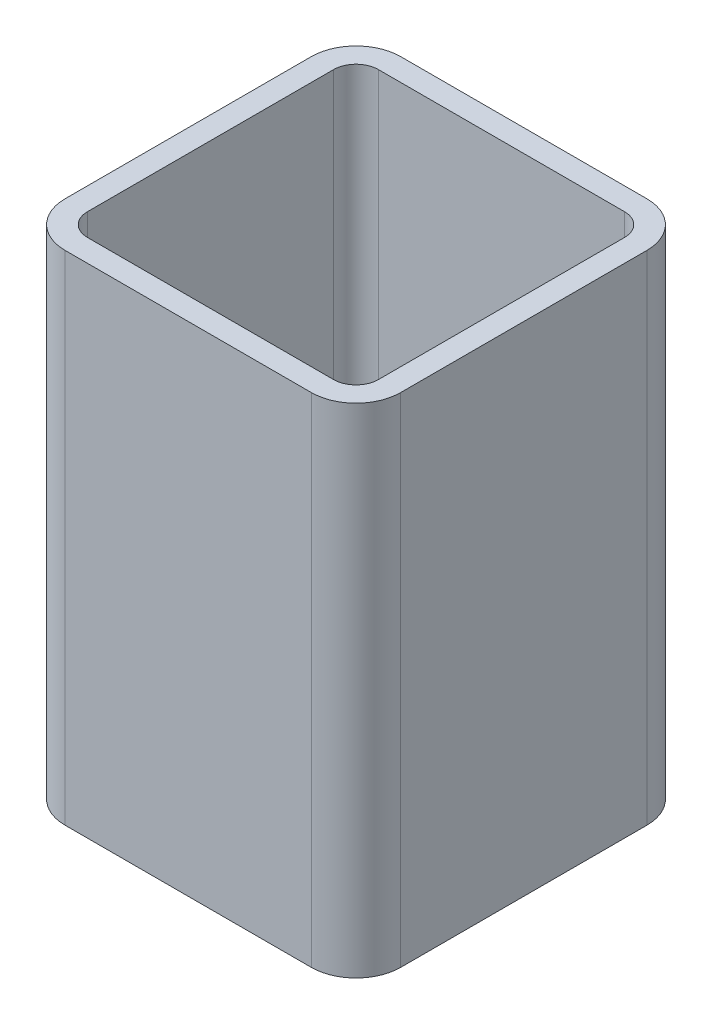
ISO-10303-21;
HEADER;
FILE_DESCRIPTION(('STEP AP214'),'2;1');
FILE_NAME('part.step','',(''),(''),'','','');
FILE_SCHEMA(('AUTOMOTIVE_DESIGN { 1 0 10303 214 1 1 1 1 }'));
ENDSEC;
DATA;
#1=APPLICATION_CONTEXT('core data for automotive mechanical design processes');
#2=APPLICATION_PROTOCOL_DEFINITION('international standard','automotive_design',2000,#1);
#3=PRODUCT_CONTEXT('',#1,'mechanical');
#4=PRODUCT('Part','Part','',(#3));
#5=PRODUCT_RELATED_PRODUCT_CATEGORY('part','',(#4));
#6=PRODUCT_DEFINITION_FORMATION('','',#4);
#7=PRODUCT_DEFINITION_CONTEXT('part definition',#1,'design');
#8=PRODUCT_DEFINITION('design','',#6,#7);
#9=PRODUCT_DEFINITION_SHAPE('','',#8);
#10=(LENGTH_UNIT() NAMED_UNIT(*) SI_UNIT(.MILLI.,.METRE.));
#11=(NAMED_UNIT(*) PLANE_ANGLE_UNIT() SI_UNIT($,.RADIAN.));
#12=(NAMED_UNIT(*) SI_UNIT($,.STERADIAN.) SOLID_ANGLE_UNIT());
#13=UNCERTAINTY_MEASURE_WITH_UNIT(LENGTH_MEASURE(1.E-05),#10,'distance_accuracy_value','');
#14=(GEOMETRIC_REPRESENTATION_CONTEXT(3) GLOBAL_UNCERTAINTY_ASSIGNED_CONTEXT((#13)) GLOBAL_UNIT_ASSIGNED_CONTEXT((#10,
#11,#12)) REPRESENTATION_CONTEXT('',''));
#15=CARTESIAN_POINT('',(0.,0.,0.));
#16=DIRECTION('',(0.,0.,1.));
#17=DIRECTION('',(1.,0.,0.));
#18=AXIS2_PLACEMENT_3D('',#15,#16,#17);
#19=CARTESIAN_POINT('',(-11.,44.5,11.));
#20=DIRECTION('',(0.,-1.,0.));
#21=DIRECTION('',(0.,0.,-1.));
#22=AXIS2_PLACEMENT_3D('',#19,#20,#21);
#23=PLANE('',#22);
#24=CARTESIAN_POINT('',(-11.,44.5,11.));
#25=DIRECTION('',(0.,1.,0.));
#26=DIRECTION('',(0.,0.,-1.));
#27=AXIS2_PLACEMENT_3D('',#24,#25,#26);
#28=CIRCLE('',#27,4.);
#29=CARTESIAN_POINT('',(-15.,44.5,11.));
#30=VERTEX_POINT('',#29);
#31=CARTESIAN_POINT('',(-11.,44.5,15.));
#32=VERTEX_POINT('',#31);
#33=EDGE_CURVE('E213',#30,#32,#28,.T.);
#34=ORIENTED_EDGE('',*,*,#33,.T.);
#35=DIRECTION('',(1.,0.,0.));
#36=VECTOR('',#35,1.);
#37=CARTESIAN_POINT('',(-11.,44.5,15.));
#38=LINE('',#37,#36);
#39=CARTESIAN_POINT('',(11.,44.5,15.));
#40=VERTEX_POINT('',#39);
#41=EDGE_CURVE('E216',#32,#40,#38,.T.);
#42=ORIENTED_EDGE('',*,*,#41,.T.);
#43=CARTESIAN_POINT('',(11.,44.5,11.));
#44=DIRECTION('',(0.,1.,0.));
#45=DIRECTION('',(0.,0.,1.));
#46=AXIS2_PLACEMENT_3D('',#43,#44,#45);
#47=CIRCLE('',#46,4.);
#48=CARTESIAN_POINT('',(15.,44.5,11.));
#49=VERTEX_POINT('',#48);
#50=EDGE_CURVE('E219',#40,#49,#47,.T.);
#51=ORIENTED_EDGE('',*,*,#50,.T.);
#52=DIRECTION('',(0.,0.,-1.));
#53=VECTOR('',#52,1.);
#54=CARTESIAN_POINT('',(15.,44.5,11.));
#55=LINE('',#54,#53);
#56=CARTESIAN_POINT('',(15.,44.5,-11.));
#57=VERTEX_POINT('',#56);
#58=EDGE_CURVE('E221',#49,#57,#55,.T.);
#59=ORIENTED_EDGE('',*,*,#58,.T.);
#60=CARTESIAN_POINT('',(11.,44.5,-11.));
#61=DIRECTION('',(0.,1.,0.));
#62=DIRECTION('',(0.,0.,-1.));
#63=AXIS2_PLACEMENT_3D('',#60,#61,#62);
#64=CIRCLE('',#63,4.);
#65=CARTESIAN_POINT('',(11.,44.5,-15.));
#66=VERTEX_POINT('',#65);
#67=EDGE_CURVE('E223',#57,#66,#64,.T.);
#68=ORIENTED_EDGE('',*,*,#67,.T.);
#69=DIRECTION('',(-1.,0.,0.));
#70=VECTOR('',#69,1.);
#71=CARTESIAN_POINT('',(-11.,44.5,-15.));
#72=LINE('',#71,#70);
#73=CARTESIAN_POINT('',(-11.,44.5,-15.));
#74=VERTEX_POINT('',#73);
#75=EDGE_CURVE('E225',#66,#74,#72,.T.);
#76=ORIENTED_EDGE('',*,*,#75,.T.);
#77=CARTESIAN_POINT('',(-11.,44.5,-11.));
#78=DIRECTION('',(0.,1.,0.));
#79=DIRECTION('',(0.,0.,-1.));
#80=AXIS2_PLACEMENT_3D('',#77,#78,#79);
#81=CIRCLE('',#80,4.);
#82=CARTESIAN_POINT('',(-15.,44.5,-11.));
#83=VERTEX_POINT('',#82);
#84=EDGE_CURVE('E227',#74,#83,#81,.T.);
#85=ORIENTED_EDGE('',*,*,#84,.T.);
#86=DIRECTION('',(0.,0.,1.));
#87=VECTOR('',#86,1.);
#88=CARTESIAN_POINT('',(-15.,44.5,11.));
#89=LINE('',#88,#87);
#90=EDGE_CURVE('E229',#83,#30,#89,.T.);
#91=ORIENTED_EDGE('',*,*,#90,.T.);
#92=EDGE_LOOP('',(#34,#42,#51,#59,#68,#76,#85,#91));
#93=FACE_BOUND('',#92,.T.);
#94=CARTESIAN_POINT('',(-11.,44.5,11.));
#95=DIRECTION('',(0.,1.,0.));
#96=DIRECTION('',(0.,0.,-1.));
#97=AXIS2_PLACEMENT_3D('',#94,#95,#96);
#98=CIRCLE('',#97,2.);
#99=CARTESIAN_POINT('',(-13.,44.5,11.));
#100=VERTEX_POINT('',#99);
#101=CARTESIAN_POINT('',(-11.,44.5,13.));
#102=VERTEX_POINT('',#101);
#103=EDGE_CURVE('E148',#100,#102,#98,.T.);
#104=ORIENTED_EDGE('',*,*,#103,.F.);
#105=DIRECTION('',(0.,0.,1.));
#106=VECTOR('',#105,1.);
#107=CARTESIAN_POINT('',(-13.,44.5,11.));
#108=LINE('',#107,#106);
#109=CARTESIAN_POINT('',(-13.,44.5,-11.));
#110=VERTEX_POINT('',#109);
#111=EDGE_CURVE('E181',#110,#100,#108,.T.);
#112=ORIENTED_EDGE('',*,*,#111,.F.);
#113=CARTESIAN_POINT('',(-11.,44.5,-11.));
#114=DIRECTION('',(0.,1.,0.));
#115=DIRECTION('',(0.,0.,-1.));
#116=AXIS2_PLACEMENT_3D('',#113,#114,#115);
#117=CIRCLE('',#116,2.);
#118=CARTESIAN_POINT('',(-11.,44.5,-13.));
#119=VERTEX_POINT('',#118);
#120=EDGE_CURVE('E179',#119,#110,#117,.T.);
#121=ORIENTED_EDGE('',*,*,#120,.F.);
#122=DIRECTION('',(-1.,0.,0.));
#123=VECTOR('',#122,1.);
#124=CARTESIAN_POINT('',(-11.,44.5,-13.));
#125=LINE('',#124,#123);
#126=CARTESIAN_POINT('',(11.,44.5,-13.));
#127=VERTEX_POINT('',#126);
#128=EDGE_CURVE('E177',#127,#119,#125,.T.);
#129=ORIENTED_EDGE('',*,*,#128,.F.);
#130=CARTESIAN_POINT('',(11.,44.5,-11.));
#131=DIRECTION('',(0.,1.,0.));
#132=DIRECTION('',(0.,0.,-1.));
#133=AXIS2_PLACEMENT_3D('',#130,#131,#132);
#134=CIRCLE('',#133,2.);
#135=CARTESIAN_POINT('',(13.,44.5,-11.));
#136=VERTEX_POINT('',#135);
#137=EDGE_CURVE('E175',#136,#127,#134,.T.);
#138=ORIENTED_EDGE('',*,*,#137,.F.);
#139=DIRECTION('',(0.,0.,-1.));
#140=VECTOR('',#139,1.);
#141=CARTESIAN_POINT('',(13.,44.5,11.));
#142=LINE('',#141,#140);
#143=CARTESIAN_POINT('',(13.,44.5,11.));
#144=VERTEX_POINT('',#143);
#145=EDGE_CURVE('E171',#144,#136,#142,.T.);
#146=ORIENTED_EDGE('',*,*,#145,.F.);
#147=CARTESIAN_POINT('',(11.,44.5,11.));
#148=DIRECTION('',(0.,1.,0.));
#149=DIRECTION('',(0.,0.,1.));
#150=AXIS2_PLACEMENT_3D('',#147,#148,#149);
#151=CIRCLE('',#150,2.);
#152=CARTESIAN_POINT('',(11.,44.5,13.));
#153=VERTEX_POINT('',#152);
#154=EDGE_CURVE('E169',#153,#144,#151,.T.);
#155=ORIENTED_EDGE('',*,*,#154,.F.);
#156=DIRECTION('',(1.,0.,0.));
#157=VECTOR('',#156,1.);
#158=CARTESIAN_POINT('',(-11.,44.5,13.));
#159=LINE('',#158,#157);
#160=EDGE_CURVE('E156',#102,#153,#159,.T.);
#161=ORIENTED_EDGE('',*,*,#160,.F.);
#162=EDGE_LOOP('',(#104,#112,#121,#129,#138,#146,#155,#161));
#163=FACE_BOUND('',#162,.T.);
#164=ADVANCED_FACE('F35',(#93,#163),#23,.F.);
#165=CARTESIAN_POINT('',(-11.,0.,11.));
#166=DIRECTION('',(0.,-1.,0.));
#167=DIRECTION('',(0.,0.,-1.));
#168=AXIS2_PLACEMENT_3D('',#165,#166,#167);
#169=PLANE('',#168);
#170=CARTESIAN_POINT('',(-11.,0.,11.));
#171=DIRECTION('',(0.,1.,0.));
#172=DIRECTION('',(0.,0.,-1.));
#173=AXIS2_PLACEMENT_3D('',#170,#171,#172);
#174=CIRCLE('',#173,4.);
#175=CARTESIAN_POINT('',(-15.,0.,11.));
#176=VERTEX_POINT('',#175);
#177=CARTESIAN_POINT('',(-11.,0.,15.));
#178=VERTEX_POINT('',#177);
#179=EDGE_CURVE('E164',#176,#178,#174,.T.);
#180=ORIENTED_EDGE('',*,*,#179,.F.);
#181=DIRECTION('',(0.,0.,1.));
#182=VECTOR('',#181,1.);
#183=CARTESIAN_POINT('',(-15.,0.,11.));
#184=LINE('',#183,#182);
#185=CARTESIAN_POINT('',(-15.,0.,-11.));
#186=VERTEX_POINT('',#185);
#187=EDGE_CURVE('E217',#186,#176,#184,.T.);
#188=ORIENTED_EDGE('',*,*,#187,.F.);
#189=CARTESIAN_POINT('',(-11.,0.,-11.));
#190=DIRECTION('',(0.,1.,0.));
#191=DIRECTION('',(0.,0.,-1.));
#192=AXIS2_PLACEMENT_3D('',#189,#190,#191);
#193=CIRCLE('',#192,4.);
#194=CARTESIAN_POINT('',(-11.,0.,-15.));
#195=VERTEX_POINT('',#194);
#196=EDGE_CURVE('E244',#195,#186,#193,.T.);
#197=ORIENTED_EDGE('',*,*,#196,.F.);
#198=DIRECTION('',(-1.,0.,0.));
#199=VECTOR('',#198,1.);
#200=CARTESIAN_POINT('',(-11.,0.,-15.));
#201=LINE('',#200,#199);
#202=CARTESIAN_POINT('',(11.,0.,-15.));
#203=VERTEX_POINT('',#202);
#204=EDGE_CURVE('E242',#203,#195,#201,.T.);
#205=ORIENTED_EDGE('',*,*,#204,.F.);
#206=CARTESIAN_POINT('',(11.,0.,-11.));
#207=DIRECTION('',(0.,1.,0.));
#208=DIRECTION('',(0.,0.,-1.));
#209=AXIS2_PLACEMENT_3D('',#206,#207,#208);
#210=CIRCLE('',#209,4.);
#211=CARTESIAN_POINT('',(15.,0.,-11.));
#212=VERTEX_POINT('',#211);
#213=EDGE_CURVE('E240',#212,#203,#210,.T.);
#214=ORIENTED_EDGE('',*,*,#213,.F.);
#215=DIRECTION('',(0.,0.,-1.));
#216=VECTOR('',#215,1.);
#217=CARTESIAN_POINT('',(15.,0.,11.));
#218=LINE('',#217,#216);
#219=CARTESIAN_POINT('',(15.,0.,11.));
#220=VERTEX_POINT('',#219);
#221=EDGE_CURVE('E238',#220,#212,#218,.T.);
#222=ORIENTED_EDGE('',*,*,#221,.F.);
#223=CARTESIAN_POINT('',(11.,0.,11.));
#224=DIRECTION('',(0.,1.,0.));
#225=DIRECTION('',(0.,0.,1.));
#226=AXIS2_PLACEMENT_3D('',#223,#224,#225);
#227=CIRCLE('',#226,4.);
#228=CARTESIAN_POINT('',(11.,0.,15.));
#229=VERTEX_POINT('',#228);
#230=EDGE_CURVE('E236',#229,#220,#227,.T.);
#231=ORIENTED_EDGE('',*,*,#230,.F.);
#232=DIRECTION('',(1.,0.,0.));
#233=VECTOR('',#232,1.);
#234=CARTESIAN_POINT('',(-11.,0.,15.));
#235=LINE('',#234,#233);
#236=EDGE_CURVE('E234',#178,#229,#235,.T.);
#237=ORIENTED_EDGE('',*,*,#236,.F.);
#238=EDGE_LOOP('',(#180,#188,#197,#205,#214,#222,#231,#237));
#239=FACE_BOUND('',#238,.T.);
#240=DIRECTION('',(0.,0.,1.));
#241=VECTOR('',#240,1.);
#242=CARTESIAN_POINT('',(-13.,0.,11.));
#243=LINE('',#242,#241);
#244=CARTESIAN_POINT('',(-13.,0.,-11.));
#245=VERTEX_POINT('',#244);
#246=CARTESIAN_POINT('',(-13.,0.,11.));
#247=VERTEX_POINT('',#246);
#248=EDGE_CURVE('E157',#245,#247,#243,.T.);
#249=ORIENTED_EDGE('',*,*,#248,.T.);
#250=CARTESIAN_POINT('',(-11.,0.,11.));
#251=DIRECTION('',(0.,1.,0.));
#252=DIRECTION('',(0.,0.,-1.));
#253=AXIS2_PLACEMENT_3D('',#250,#251,#252);
#254=CIRCLE('',#253,2.);
#255=CARTESIAN_POINT('',(-11.,0.,13.));
#256=VERTEX_POINT('',#255);
#257=EDGE_CURVE('E58',#247,#256,#254,.T.);
#258=ORIENTED_EDGE('',*,*,#257,.T.);
#259=DIRECTION('',(1.,0.,0.));
#260=VECTOR('',#259,1.);
#261=CARTESIAN_POINT('',(-11.,0.,13.));
#262=LINE('',#261,#260);
#263=CARTESIAN_POINT('',(11.,0.,13.));
#264=VERTEX_POINT('',#263);
#265=EDGE_CURVE('E163',#256,#264,#262,.T.);
#266=ORIENTED_EDGE('',*,*,#265,.T.);
#267=CARTESIAN_POINT('',(11.,0.,11.));
#268=DIRECTION('',(0.,1.,0.));
#269=DIRECTION('',(0.,0.,1.));
#270=AXIS2_PLACEMENT_3D('',#267,#268,#269);
#271=CIRCLE('',#270,2.);
#272=CARTESIAN_POINT('',(13.,0.,11.));
#273=VERTEX_POINT('',#272);
#274=EDGE_CURVE('E185',#264,#273,#271,.T.);
#275=ORIENTED_EDGE('',*,*,#274,.T.);
#276=DIRECTION('',(0.,0.,-1.));
#277=VECTOR('',#276,1.);
#278=CARTESIAN_POINT('',(13.,0.,11.));
#279=LINE('',#278,#277);
#280=CARTESIAN_POINT('',(13.,0.,-11.));
#281=VERTEX_POINT('',#280);
#282=EDGE_CURVE('E188',#273,#281,#279,.T.);
#283=ORIENTED_EDGE('',*,*,#282,.T.);
#284=CARTESIAN_POINT('',(11.,0.,-11.));
#285=DIRECTION('',(0.,1.,0.));
#286=DIRECTION('',(0.,0.,-1.));
#287=AXIS2_PLACEMENT_3D('',#284,#285,#286);
#288=CIRCLE('',#287,2.);
#289=CARTESIAN_POINT('',(11.,0.,-13.));
#290=VERTEX_POINT('',#289);
#291=EDGE_CURVE('E191',#281,#290,#288,.T.);
#292=ORIENTED_EDGE('',*,*,#291,.T.);
#293=DIRECTION('',(-1.,0.,0.));
#294=VECTOR('',#293,1.);
#295=CARTESIAN_POINT('',(-11.,0.,-13.));
#296=LINE('',#295,#294);
#297=CARTESIAN_POINT('',(-11.,0.,-13.));
#298=VERTEX_POINT('',#297);
#299=EDGE_CURVE('E194',#290,#298,#296,.T.);
#300=ORIENTED_EDGE('',*,*,#299,.T.);
#301=CARTESIAN_POINT('',(-11.,0.,-11.));
#302=DIRECTION('',(0.,1.,0.));
#303=DIRECTION('',(0.,0.,-1.));
#304=AXIS2_PLACEMENT_3D('',#301,#302,#303);
#305=CIRCLE('',#304,2.);
#306=EDGE_CURVE('E197',#298,#245,#305,.T.);
#307=ORIENTED_EDGE('',*,*,#306,.T.);
#308=EDGE_LOOP('',(#249,#258,#266,#275,#283,#292,#300,#307));
#309=FACE_BOUND('',#308,.T.);
#310=ADVANCED_FACE('F274',(#239,#309),#169,.T.);
#311=CARTESIAN_POINT('',(-11.,44.5,11.));
#312=DIRECTION('',(0.,-1.,0.));
#313=DIRECTION('',(0.,0.,-1.));
#314=AXIS2_PLACEMENT_3D('',#311,#312,#313);
#315=CYLINDRICAL_SURFACE('',#314,4.);
#316=ORIENTED_EDGE('',*,*,#179,.T.);
#317=DIRECTION('',(0.,-1.,0.));
#318=VECTOR('',#317,1.);
#319=CARTESIAN_POINT('',(-11.,44.5,15.));
#320=LINE('',#319,#318);
#321=EDGE_CURVE('E11',#32,#178,#320,.T.);
#322=ORIENTED_EDGE('',*,*,#321,.F.);
#323=ORIENTED_EDGE('',*,*,#33,.F.);
#324=DIRECTION('',(0.,-1.,0.));
#325=VECTOR('',#324,1.);
#326=CARTESIAN_POINT('',(-15.,44.5,11.));
#327=LINE('',#326,#325);
#328=EDGE_CURVE('E231',#30,#176,#327,.T.);
#329=ORIENTED_EDGE('',*,*,#328,.T.);
#330=EDGE_LOOP('',(#316,#322,#323,#329));
#331=FACE_BOUND('',#330,.T.);
#332=ADVANCED_FACE('F37',(#331),#315,.T.);
#333=CARTESIAN_POINT('',(-11.,44.5,15.));
#334=DIRECTION('',(0.,0.,-1.));
#335=DIRECTION('',(-1.,0.,0.));
#336=AXIS2_PLACEMENT_3D('',#333,#334,#335);
#337=PLANE('',#336);
#338=ORIENTED_EDGE('',*,*,#236,.T.);
#339=DIRECTION('',(0.,-1.,0.));
#340=VECTOR('',#339,1.);
#341=CARTESIAN_POINT('',(11.,44.5,15.));
#342=LINE('',#341,#340);
#343=EDGE_CURVE('E43',#40,#229,#342,.T.);
#344=ORIENTED_EDGE('',*,*,#343,.F.);
#345=ORIENTED_EDGE('',*,*,#41,.F.);
#346=ORIENTED_EDGE('',*,*,#321,.T.);
#347=EDGE_LOOP('',(#338,#344,#345,#346));
#348=FACE_BOUND('',#347,.T.);
#349=ADVANCED_FACE('F291',(#348),#337,.F.);
#350=CARTESIAN_POINT('',(11.,44.5,11.));
#351=DIRECTION('',(0.,-1.,0.));
#352=DIRECTION('',(0.,0.,-1.));
#353=AXIS2_PLACEMENT_3D('',#350,#351,#352);
#354=CYLINDRICAL_SURFACE('',#353,4.);
#355=ORIENTED_EDGE('',*,*,#230,.T.);
#356=DIRECTION('',(0.,-1.,0.));
#357=VECTOR('',#356,1.);
#358=CARTESIAN_POINT('',(15.,44.5,11.));
#359=LINE('',#358,#357);
#360=EDGE_CURVE('E261',#49,#220,#359,.T.);
#361=ORIENTED_EDGE('',*,*,#360,.F.);
#362=ORIENTED_EDGE('',*,*,#50,.F.);
#363=ORIENTED_EDGE('',*,*,#343,.T.);
#364=EDGE_LOOP('',(#355,#361,#362,#363));
#365=FACE_BOUND('',#364,.T.);
#366=ADVANCED_FACE('F268',(#365),#354,.T.);
#367=CARTESIAN_POINT('',(15.,44.5,11.));
#368=DIRECTION('',(-1.,0.,0.));
#369=DIRECTION('',(0.,0.,1.));
#370=AXIS2_PLACEMENT_3D('',#367,#368,#369);
#371=PLANE('',#370);
#372=ORIENTED_EDGE('',*,*,#221,.T.);
#373=DIRECTION('',(0.,-1.,0.));
#374=VECTOR('',#373,1.);
#375=CARTESIAN_POINT('',(15.,44.5,-11.));
#376=LINE('',#375,#374);
#377=EDGE_CURVE('E258',#57,#212,#376,.T.);
#378=ORIENTED_EDGE('',*,*,#377,.F.);
#379=ORIENTED_EDGE('',*,*,#58,.F.);
#380=ORIENTED_EDGE('',*,*,#360,.T.);
#381=EDGE_LOOP('',(#372,#378,#379,#380));
#382=FACE_BOUND('',#381,.T.);
#383=ADVANCED_FACE('F280',(#382),#371,.F.);
#384=CARTESIAN_POINT('',(11.,44.5,-11.));
#385=DIRECTION('',(0.,-1.,0.));
#386=DIRECTION('',(0.,0.,-1.));
#387=AXIS2_PLACEMENT_3D('',#384,#385,#386);
#388=CYLINDRICAL_SURFACE('',#387,4.);
#389=ORIENTED_EDGE('',*,*,#213,.T.);
#390=DIRECTION('',(0.,-1.,0.));
#391=VECTOR('',#390,1.);
#392=CARTESIAN_POINT('',(11.,44.5,-15.));
#393=LINE('',#392,#391);
#394=EDGE_CURVE('E255',#66,#203,#393,.T.);
#395=ORIENTED_EDGE('',*,*,#394,.F.);
#396=ORIENTED_EDGE('',*,*,#67,.F.);
#397=ORIENTED_EDGE('',*,*,#377,.T.);
#398=EDGE_LOOP('',(#389,#395,#396,#397));
#399=FACE_BOUND('',#398,.T.);
#400=ADVANCED_FACE('F284',(#399),#388,.T.);
#401=CARTESIAN_POINT('',(-11.,44.5,-15.));
#402=DIRECTION('',(0.,0.,1.));
#403=DIRECTION('',(1.,0.,0.));
#404=AXIS2_PLACEMENT_3D('',#401,#402,#403);
#405=PLANE('',#404);
#406=ORIENTED_EDGE('',*,*,#204,.T.);
#407=DIRECTION('',(0.,-1.,0.));
#408=VECTOR('',#407,1.);
#409=CARTESIAN_POINT('',(-11.,44.5,-15.));
#410=LINE('',#409,#408);
#411=EDGE_CURVE('E252',#74,#195,#410,.T.);
#412=ORIENTED_EDGE('',*,*,#411,.F.);
#413=ORIENTED_EDGE('',*,*,#75,.F.);
#414=ORIENTED_EDGE('',*,*,#394,.T.);
#415=EDGE_LOOP('',(#406,#412,#413,#414));
#416=FACE_BOUND('',#415,.T.);
#417=ADVANCED_FACE('F304',(#416),#405,.F.);
#418=CARTESIAN_POINT('',(-11.,44.5,-11.));
#419=DIRECTION('',(0.,-1.,0.));
#420=DIRECTION('',(0.,0.,-1.));
#421=AXIS2_PLACEMENT_3D('',#418,#419,#420);
#422=CYLINDRICAL_SURFACE('',#421,4.);
#423=ORIENTED_EDGE('',*,*,#196,.T.);
#424=DIRECTION('',(0.,-1.,0.));
#425=VECTOR('',#424,1.);
#426=CARTESIAN_POINT('',(-15.,44.5,-11.));
#427=LINE('',#426,#425);
#428=EDGE_CURVE('E249',#83,#186,#427,.T.);
#429=ORIENTED_EDGE('',*,*,#428,.F.);
#430=ORIENTED_EDGE('',*,*,#84,.F.);
#431=ORIENTED_EDGE('',*,*,#411,.T.);
#432=EDGE_LOOP('',(#423,#429,#430,#431));
#433=FACE_BOUND('',#432,.T.);
#434=ADVANCED_FACE('F302',(#433),#422,.T.);
#435=CARTESIAN_POINT('',(-15.,44.5,11.));
#436=DIRECTION('',(1.,0.,0.));
#437=DIRECTION('',(0.,0.,-1.));
#438=AXIS2_PLACEMENT_3D('',#435,#436,#437);
#439=PLANE('',#438);
#440=ORIENTED_EDGE('',*,*,#187,.T.);
#441=ORIENTED_EDGE('',*,*,#328,.F.);
#442=ORIENTED_EDGE('',*,*,#90,.F.);
#443=ORIENTED_EDGE('',*,*,#428,.T.);
#444=EDGE_LOOP('',(#440,#441,#442,#443));
#445=FACE_BOUND('',#444,.T.);
#446=ADVANCED_FACE('F297',(#445),#439,.F.);
#447=CARTESIAN_POINT('',(-11.,44.5,11.));
#448=DIRECTION('',(0.,-1.,0.));
#449=DIRECTION('',(0.,0.,-1.));
#450=AXIS2_PLACEMENT_3D('',#447,#448,#449);
#451=CYLINDRICAL_SURFACE('',#450,2.);
#452=ORIENTED_EDGE('',*,*,#257,.F.);
#453=DIRECTION('',(0.,-1.,0.));
#454=VECTOR('',#453,1.);
#455=CARTESIAN_POINT('',(-13.,44.5,11.));
#456=LINE('',#455,#454);
#457=EDGE_CURVE('E152',#100,#247,#456,.T.);
#458=ORIENTED_EDGE('',*,*,#457,.F.);
#459=ORIENTED_EDGE('',*,*,#103,.T.);
#460=DIRECTION('',(0.,-1.,0.));
#461=VECTOR('',#460,1.);
#462=CARTESIAN_POINT('',(-11.,44.5,13.));
#463=LINE('',#462,#461);
#464=EDGE_CURVE('E151',#102,#256,#463,.T.);
#465=ORIENTED_EDGE('',*,*,#464,.T.);
#466=EDGE_LOOP('',(#452,#458,#459,#465));
#467=FACE_BOUND('',#466,.T.);
#468=ADVANCED_FACE('F150',(#467),#451,.F.);
#469=CARTESIAN_POINT('',(-11.,44.5,13.));
#470=DIRECTION('',(0.,0.,-1.));
#471=DIRECTION('',(-1.,0.,0.));
#472=AXIS2_PLACEMENT_3D('',#469,#470,#471);
#473=PLANE('',#472);
#474=ORIENTED_EDGE('',*,*,#265,.F.);
#475=ORIENTED_EDGE('',*,*,#464,.F.);
#476=ORIENTED_EDGE('',*,*,#160,.T.);
#477=DIRECTION('',(0.,-1.,0.));
#478=VECTOR('',#477,1.);
#479=CARTESIAN_POINT('',(11.,44.5,13.));
#480=LINE('',#479,#478);
#481=EDGE_CURVE('E165',#153,#264,#480,.T.);
#482=ORIENTED_EDGE('',*,*,#481,.T.);
#483=EDGE_LOOP('',(#474,#475,#476,#482));
#484=FACE_BOUND('',#483,.T.);
#485=ADVANCED_FACE('F160',(#484),#473,.T.);
#486=CARTESIAN_POINT('',(11.,44.5,11.));
#487=DIRECTION('',(0.,-1.,0.));
#488=DIRECTION('',(0.,0.,-1.));
#489=AXIS2_PLACEMENT_3D('',#486,#487,#488);
#490=CYLINDRICAL_SURFACE('',#489,2.);
#491=ORIENTED_EDGE('',*,*,#274,.F.);
#492=ORIENTED_EDGE('',*,*,#481,.F.);
#493=ORIENTED_EDGE('',*,*,#154,.T.);
#494=DIRECTION('',(0.,-1.,0.));
#495=VECTOR('',#494,1.);
#496=CARTESIAN_POINT('',(13.,44.5,11.));
#497=LINE('',#496,#495);
#498=EDGE_CURVE('E210',#144,#273,#497,.T.);
#499=ORIENTED_EDGE('',*,*,#498,.T.);
#500=EDGE_LOOP('',(#491,#492,#493,#499));
#501=FACE_BOUND('',#500,.T.);
#502=ADVANCED_FACE('F329',(#501),#490,.F.);
#503=CARTESIAN_POINT('',(13.,44.5,11.));
#504=DIRECTION('',(-1.,0.,0.));
#505=DIRECTION('',(0.,0.,1.));
#506=AXIS2_PLACEMENT_3D('',#503,#504,#505);
#507=PLANE('',#506);
#508=ORIENTED_EDGE('',*,*,#282,.F.);
#509=ORIENTED_EDGE('',*,*,#498,.F.);
#510=ORIENTED_EDGE('',*,*,#145,.T.);
#511=DIRECTION('',(0.,-1.,0.));
#512=VECTOR('',#511,1.);
#513=CARTESIAN_POINT('',(13.,44.5,-11.));
#514=LINE('',#513,#512);
#515=EDGE_CURVE('E208',#136,#281,#514,.T.);
#516=ORIENTED_EDGE('',*,*,#515,.T.);
#517=EDGE_LOOP('',(#508,#509,#510,#516));
#518=FACE_BOUND('',#517,.T.);
#519=ADVANCED_FACE('F333',(#518),#507,.T.);
#520=CARTESIAN_POINT('',(11.,44.5,-11.));
#521=DIRECTION('',(0.,-1.,0.));
#522=DIRECTION('',(0.,0.,-1.));
#523=AXIS2_PLACEMENT_3D('',#520,#521,#522);
#524=CYLINDRICAL_SURFACE('',#523,2.);
#525=ORIENTED_EDGE('',*,*,#291,.F.);
#526=ORIENTED_EDGE('',*,*,#515,.F.);
#527=ORIENTED_EDGE('',*,*,#137,.T.);
#528=DIRECTION('',(0.,-1.,0.));
#529=VECTOR('',#528,1.);
#530=CARTESIAN_POINT('',(11.,44.5,-13.));
#531=LINE('',#530,#529);
#532=EDGE_CURVE('E206',#127,#290,#531,.T.);
#533=ORIENTED_EDGE('',*,*,#532,.T.);
#534=EDGE_LOOP('',(#525,#526,#527,#533));
#535=FACE_BOUND('',#534,.T.);
#536=ADVANCED_FACE('F339',(#535),#524,.F.);
#537=CARTESIAN_POINT('',(-11.,44.5,-13.));
#538=DIRECTION('',(0.,0.,1.));
#539=DIRECTION('',(1.,0.,0.));
#540=AXIS2_PLACEMENT_3D('',#537,#538,#539);
#541=PLANE('',#540);
#542=ORIENTED_EDGE('',*,*,#299,.F.);
#543=ORIENTED_EDGE('',*,*,#532,.F.);
#544=ORIENTED_EDGE('',*,*,#128,.T.);
#545=DIRECTION('',(0.,-1.,0.));
#546=VECTOR('',#545,1.);
#547=CARTESIAN_POINT('',(-11.,44.5,-13.));
#548=LINE('',#547,#546);
#549=EDGE_CURVE('E204',#119,#298,#548,.T.);
#550=ORIENTED_EDGE('',*,*,#549,.T.);
#551=EDGE_LOOP('',(#542,#543,#544,#550));
#552=FACE_BOUND('',#551,.T.);
#553=ADVANCED_FACE('F343',(#552),#541,.T.);
#554=CARTESIAN_POINT('',(-11.,44.5,-11.));
#555=DIRECTION('',(0.,-1.,0.));
#556=DIRECTION('',(0.,0.,-1.));
#557=AXIS2_PLACEMENT_3D('',#554,#555,#556);
#558=CYLINDRICAL_SURFACE('',#557,2.);
#559=ORIENTED_EDGE('',*,*,#306,.F.);
#560=ORIENTED_EDGE('',*,*,#549,.F.);
#561=ORIENTED_EDGE('',*,*,#120,.T.);
#562=DIRECTION('',(0.,-1.,0.));
#563=VECTOR('',#562,1.);
#564=CARTESIAN_POINT('',(-13.,44.5,-11.));
#565=LINE('',#564,#563);
#566=EDGE_CURVE('E50',#110,#245,#565,.T.);
#567=ORIENTED_EDGE('',*,*,#566,.T.);
#568=EDGE_LOOP('',(#559,#560,#561,#567));
#569=FACE_BOUND('',#568,.T.);
#570=ADVANCED_FACE('F347',(#569),#558,.F.);
#571=CARTESIAN_POINT('',(-13.,44.5,11.));
#572=DIRECTION('',(1.,0.,0.));
#573=DIRECTION('',(0.,0.,-1.));
#574=AXIS2_PLACEMENT_3D('',#571,#572,#573);
#575=PLANE('',#574);
#576=ORIENTED_EDGE('',*,*,#248,.F.);
#577=ORIENTED_EDGE('',*,*,#566,.F.);
#578=ORIENTED_EDGE('',*,*,#111,.T.);
#579=ORIENTED_EDGE('',*,*,#457,.T.);
#580=EDGE_LOOP('',(#576,#577,#578,#579));
#581=FACE_BOUND('',#580,.T.);
#582=ADVANCED_FACE('F351',(#581),#575,.T.);
#583=CLOSED_SHELL('',(#164,#310,#332,#349,#366,#383,#400,#417,#434,#446,#468,#485,#502,#519,
#536,#553,#570,#582));
#584=MANIFOLD_SOLID_BREP('B2',#583);
#585=ADVANCED_BREP_SHAPE_REPRESENTATION('',(#18,#584),#14);
#586=SHAPE_DEFINITION_REPRESENTATION(#9,#585);
ENDSEC;
END-ISO-10303-21;
